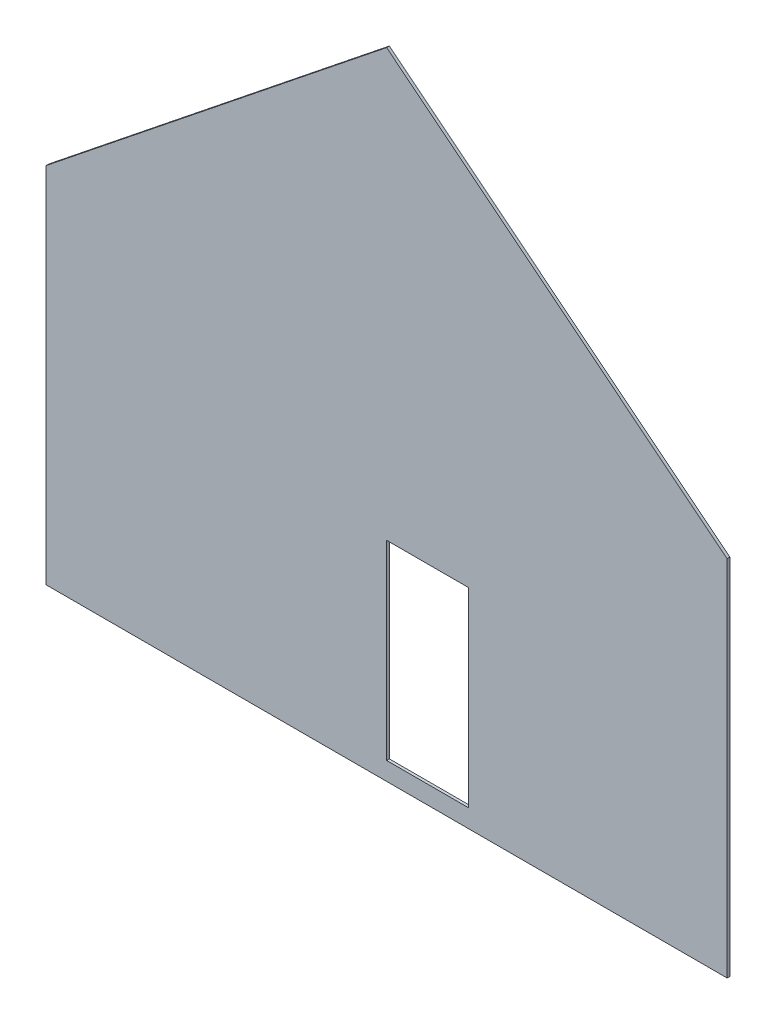
ISO-10303-21;
HEADER;
FILE_DESCRIPTION(('STEP AP214'),'2;1');
FILE_NAME('part.step','',(''),(''),'','','');
FILE_SCHEMA(('AUTOMOTIVE_DESIGN { 1 0 10303 214 1 1 1 1 }'));
ENDSEC;
DATA;
#1=APPLICATION_CONTEXT('core data for automotive mechanical design processes');
#2=APPLICATION_PROTOCOL_DEFINITION('international standard','automotive_design',2000,#1);
#3=PRODUCT_CONTEXT('',#1,'mechanical');
#4=PRODUCT('Part','Part','',(#3));
#5=PRODUCT_RELATED_PRODUCT_CATEGORY('part','',(#4));
#6=PRODUCT_DEFINITION_FORMATION('','',#4);
#7=PRODUCT_DEFINITION_CONTEXT('part definition',#1,'design');
#8=PRODUCT_DEFINITION('design','',#6,#7);
#9=PRODUCT_DEFINITION_SHAPE('','',#8);
#10=(LENGTH_UNIT() NAMED_UNIT(*) SI_UNIT(.MILLI.,.METRE.));
#11=(NAMED_UNIT(*) PLANE_ANGLE_UNIT() SI_UNIT($,.RADIAN.));
#12=(NAMED_UNIT(*) SI_UNIT($,.STERADIAN.) SOLID_ANGLE_UNIT());
#13=UNCERTAINTY_MEASURE_WITH_UNIT(LENGTH_MEASURE(1.E-05),#10,'distance_accuracy_value','');
#14=(GEOMETRIC_REPRESENTATION_CONTEXT(3) GLOBAL_UNCERTAINTY_ASSIGNED_CONTEXT((#13)) GLOBAL_UNIT_ASSIGNED_CONTEXT((#10,
#11,#12)) REPRESENTATION_CONTEXT('',''));
#15=CARTESIAN_POINT('',(0.,0.,0.));
#16=DIRECTION('',(0.,0.,1.));
#17=DIRECTION('',(1.,0.,0.));
#18=AXIS2_PLACEMENT_3D('',#15,#16,#17);
#19=CARTESIAN_POINT('',(3750.,7000.,30.));
#20=DIRECTION('',(0.624695047554424,-0.78086880944303,0.));
#21=DIRECTION('',(0.78086880944303,0.624695047554424,0.));
#22=AXIS2_PLACEMENT_3D('',#19,#20,#21);
#23=PLANE('',#22);
#24=DIRECTION('',(-0.78086880944303,-0.624695047554424,0.));
#25=VECTOR('',#24,1.);
#26=CARTESIAN_POINT('',(3750.,7000.,0.));
#27=LINE('',#26,#25);
#28=CARTESIAN_POINT('',(3750.,7000.,0.));
#29=VERTEX_POINT('',#28);
#30=CARTESIAN_POINT('',(0.,4000.,0.));
#31=VERTEX_POINT('',#30);
#32=EDGE_CURVE('E152',#29,#31,#27,.T.);
#33=ORIENTED_EDGE('',*,*,#32,.T.);
#34=DIRECTION('',(0.,0.,-1.));
#35=VECTOR('',#34,1.);
#36=CARTESIAN_POINT('',(0.,4000.,30.));
#37=LINE('',#36,#35);
#38=CARTESIAN_POINT('',(0.,4000.,30.));
#39=VERTEX_POINT('',#38);
#40=EDGE_CURVE('E204',#39,#31,#37,.T.);
#41=ORIENTED_EDGE('',*,*,#40,.F.);
#42=DIRECTION('',(-0.78086880944303,-0.624695047554424,0.));
#43=VECTOR('',#42,1.);
#44=CARTESIAN_POINT('',(3750.,7000.,30.));
#45=LINE('',#44,#43);
#46=CARTESIAN_POINT('',(3750.,7000.,30.));
#47=VERTEX_POINT('',#46);
#48=EDGE_CURVE('E157',#47,#39,#45,.T.);
#49=ORIENTED_EDGE('',*,*,#48,.F.);
#50=DIRECTION('',(0.,0.,-1.));
#51=VECTOR('',#50,1.);
#52=CARTESIAN_POINT('',(3750.,7000.,30.));
#53=LINE('',#52,#51);
#54=EDGE_CURVE('E174',#47,#29,#53,.T.);
#55=ORIENTED_EDGE('',*,*,#54,.T.);
#56=EDGE_LOOP('',(#33,#41,#49,#55));
#57=FACE_BOUND('',#56,.T.);
#58=ADVANCED_FACE('F47',(#57),#23,.F.);
#59=CARTESIAN_POINT('',(0.,0.,30.));
#60=DIRECTION('',(-1.,0.,0.));
#61=DIRECTION('',(0.,0.,1.));
#62=AXIS2_PLACEMENT_3D('',#59,#60,#61);
#63=PLANE('',#62);
#64=DIRECTION('',(0.,1.,0.));
#65=VECTOR('',#64,1.);
#66=CARTESIAN_POINT('',(0.,0.,0.));
#67=LINE('',#66,#65);
#68=CARTESIAN_POINT('',(0.,0.,0.));
#69=VERTEX_POINT('',#68);
#70=EDGE_CURVE('E178',#69,#31,#67,.T.);
#71=ORIENTED_EDGE('',*,*,#70,.F.);
#72=DIRECTION('',(0.,0.,-1.));
#73=VECTOR('',#72,1.);
#74=CARTESIAN_POINT('',(0.,0.,30.));
#75=LINE('',#74,#73);
#76=CARTESIAN_POINT('',(0.,0.,30.));
#77=VERTEX_POINT('',#76);
#78=EDGE_CURVE('E202',#77,#69,#75,.T.);
#79=ORIENTED_EDGE('',*,*,#78,.F.);
#80=DIRECTION('',(0.,1.,0.));
#81=VECTOR('',#80,1.);
#82=CARTESIAN_POINT('',(0.,0.,30.));
#83=LINE('',#82,#81);
#84=EDGE_CURVE('E159',#77,#39,#83,.T.);
#85=ORIENTED_EDGE('',*,*,#84,.T.);
#86=ORIENTED_EDGE('',*,*,#40,.T.);
#87=EDGE_LOOP('',(#71,#79,#85,#86));
#88=FACE_BOUND('',#87,.T.);
#89=ADVANCED_FACE('F231',(#88),#63,.T.);
#90=CARTESIAN_POINT('',(0.,0.,30.));
#91=DIRECTION('',(0.,1.,0.));
#92=DIRECTION('',(0.,0.,1.));
#93=AXIS2_PLACEMENT_3D('',#90,#91,#92);
#94=PLANE('',#93);
#95=DIRECTION('',(1.,0.,0.));
#96=VECTOR('',#95,1.);
#97=CARTESIAN_POINT('',(0.,0.,0.));
#98=LINE('',#97,#96);
#99=CARTESIAN_POINT('',(7500.,0.,0.));
#100=VERTEX_POINT('',#99);
#101=EDGE_CURVE('E185',#69,#100,#98,.T.);
#102=ORIENTED_EDGE('',*,*,#101,.T.);
#103=DIRECTION('',(0.,0.,-1.));
#104=VECTOR('',#103,1.);
#105=CARTESIAN_POINT('',(7500.,0.,30.));
#106=LINE('',#105,#104);
#107=CARTESIAN_POINT('',(7500.,0.,30.));
#108=VERTEX_POINT('',#107);
#109=EDGE_CURVE('E200',#108,#100,#106,.T.);
#110=ORIENTED_EDGE('',*,*,#109,.F.);
#111=DIRECTION('',(1.,0.,0.));
#112=VECTOR('',#111,1.);
#113=CARTESIAN_POINT('',(0.,0.,30.));
#114=LINE('',#113,#112);
#115=EDGE_CURVE('E164',#77,#108,#114,.T.);
#116=ORIENTED_EDGE('',*,*,#115,.F.);
#117=ORIENTED_EDGE('',*,*,#78,.T.);
#118=EDGE_LOOP('',(#102,#110,#116,#117));
#119=FACE_BOUND('',#118,.T.);
#120=ADVANCED_FACE('F237',(#119),#94,.F.);
#121=CARTESIAN_POINT('',(7500.,0.,30.));
#122=DIRECTION('',(-1.,0.,0.));
#123=DIRECTION('',(0.,0.,1.));
#124=AXIS2_PLACEMENT_3D('',#121,#122,#123);
#125=PLANE('',#124);
#126=DIRECTION('',(0.,1.,0.));
#127=VECTOR('',#126,1.);
#128=CARTESIAN_POINT('',(7500.,0.,0.));
#129=LINE('',#128,#127);
#130=CARTESIAN_POINT('',(7500.,4000.,0.));
#131=VERTEX_POINT('',#130);
#132=EDGE_CURVE('E184',#100,#131,#129,.T.);
#133=ORIENTED_EDGE('',*,*,#132,.T.);
#134=DIRECTION('',(0.,0.,-1.));
#135=VECTOR('',#134,1.);
#136=CARTESIAN_POINT('',(7500.,4000.,30.));
#137=LINE('',#136,#135);
#138=CARTESIAN_POINT('',(7500.,4000.,30.));
#139=VERTEX_POINT('',#138);
#140=EDGE_CURVE('E191',#139,#131,#137,.T.);
#141=ORIENTED_EDGE('',*,*,#140,.F.);
#142=DIRECTION('',(0.,1.,0.));
#143=VECTOR('',#142,1.);
#144=CARTESIAN_POINT('',(7500.,0.,30.));
#145=LINE('',#144,#143);
#146=EDGE_CURVE('E167',#108,#139,#145,.T.);
#147=ORIENTED_EDGE('',*,*,#146,.F.);
#148=ORIENTED_EDGE('',*,*,#109,.T.);
#149=EDGE_LOOP('',(#133,#141,#147,#148));
#150=FACE_BOUND('',#149,.T.);
#151=ADVANCED_FACE('F254',(#150),#125,.F.);
#152=CARTESIAN_POINT('',(3750.,7000.,30.));
#153=DIRECTION('',(0.624695047554424,0.78086880944303,0.));
#154=DIRECTION('',(-0.780868809443031,0.624695047554424,0.));
#155=AXIS2_PLACEMENT_3D('',#152,#153,#154);
#156=PLANE('',#155);
#157=DIRECTION('',(0.78086880944303,-0.624695047554424,0.));
#158=VECTOR('',#157,1.);
#159=CARTESIAN_POINT('',(3750.,7000.,0.));
#160=LINE('',#159,#158);
#161=EDGE_CURVE('E158',#29,#131,#160,.T.);
#162=ORIENTED_EDGE('',*,*,#161,.F.);
#163=ORIENTED_EDGE('',*,*,#54,.F.);
#164=DIRECTION('',(0.78086880944303,-0.624695047554424,0.));
#165=VECTOR('',#164,1.);
#166=CARTESIAN_POINT('',(3750.,7000.,30.));
#167=LINE('',#166,#165);
#168=EDGE_CURVE('E169',#47,#139,#167,.T.);
#169=ORIENTED_EDGE('',*,*,#168,.T.);
#170=ORIENTED_EDGE('',*,*,#140,.T.);
#171=EDGE_LOOP('',(#162,#163,#169,#170));
#172=FACE_BOUND('',#171,.T.);
#173=ADVANCED_FACE('F255',(#172),#156,.T.);
#174=CARTESIAN_POINT('',(0.,0.,30.));
#175=DIRECTION('',(0.,0.,1.));
#176=DIRECTION('',(1.,0.,0.));
#177=AXIS2_PLACEMENT_3D('',#174,#175,#176);
#178=PLANE('',#177);
#179=DIRECTION('',(1.,0.,0.));
#180=VECTOR('',#179,1.);
#181=CARTESIAN_POINT('',(3750.,200.,30.));
#182=LINE('',#181,#180);
#183=CARTESIAN_POINT('',(3750.,200.,30.));
#184=VERTEX_POINT('',#183);
#185=CARTESIAN_POINT('',(4650.,200.,30.));
#186=VERTEX_POINT('',#185);
#187=EDGE_CURVE('E64',#184,#186,#182,.T.);
#188=ORIENTED_EDGE('',*,*,#187,.F.);
#189=DIRECTION('',(0.,-1.,0.));
#190=VECTOR('',#189,1.);
#191=CARTESIAN_POINT('',(3750.,2300.,30.));
#192=LINE('',#191,#190);
#193=CARTESIAN_POINT('',(3750.,2300.,30.));
#194=VERTEX_POINT('',#193);
#195=EDGE_CURVE('E141',#194,#184,#192,.T.);
#196=ORIENTED_EDGE('',*,*,#195,.F.);
#197=DIRECTION('',(1.,0.,0.));
#198=VECTOR('',#197,1.);
#199=CARTESIAN_POINT('',(3750.,2300.,30.));
#200=LINE('',#199,#198);
#201=CARTESIAN_POINT('',(4650.,2300.,30.));
#202=VERTEX_POINT('',#201);
#203=EDGE_CURVE('E121',#194,#202,#200,.T.);
#204=ORIENTED_EDGE('',*,*,#203,.T.);
#205=DIRECTION('',(0.,-1.,0.));
#206=VECTOR('',#205,1.);
#207=CARTESIAN_POINT('',(4650.,2300.,30.));
#208=LINE('',#207,#206);
#209=EDGE_CURVE('E133',#202,#186,#208,.T.);
#210=ORIENTED_EDGE('',*,*,#209,.T.);
#211=EDGE_LOOP('',(#188,#196,#204,#210));
#212=FACE_BOUND('',#211,.T.);
#213=ORIENTED_EDGE('',*,*,#48,.T.);
#214=ORIENTED_EDGE('',*,*,#84,.F.);
#215=ORIENTED_EDGE('',*,*,#115,.T.);
#216=ORIENTED_EDGE('',*,*,#146,.T.);
#217=ORIENTED_EDGE('',*,*,#168,.F.);
#218=EDGE_LOOP('',(#213,#214,#215,#216,#217));
#219=FACE_BOUND('',#218,.T.);
#220=ADVANCED_FACE('F138',(#212,#219),#178,.T.);
#221=CARTESIAN_POINT('',(0.,0.,0.));
#222=DIRECTION('',(0.,0.,1.));
#223=DIRECTION('',(1.,0.,0.));
#224=AXIS2_PLACEMENT_3D('',#221,#222,#223);
#225=PLANE('',#224);
#226=DIRECTION('',(0.,-1.,0.));
#227=VECTOR('',#226,1.);
#228=CARTESIAN_POINT('',(3750.,0.,0.));
#229=LINE('',#228,#227);
#230=CARTESIAN_POINT('',(3750.,2300.,0.));
#231=VERTEX_POINT('',#230);
#232=CARTESIAN_POINT('',(3750.,200.,0.));
#233=VERTEX_POINT('',#232);
#234=EDGE_CURVE('E60',#231,#233,#229,.T.);
#235=ORIENTED_EDGE('',*,*,#234,.T.);
#236=DIRECTION('',(1.,0.,0.));
#237=VECTOR('',#236,1.);
#238=CARTESIAN_POINT('',(0.,199.999999999999,0.));
#239=LINE('',#238,#237);
#240=CARTESIAN_POINT('',(4650.,200.,0.));
#241=VERTEX_POINT('',#240);
#242=EDGE_CURVE('E11',#233,#241,#239,.T.);
#243=ORIENTED_EDGE('',*,*,#242,.T.);
#244=DIRECTION('',(0.,-1.,0.));
#245=VECTOR('',#244,1.);
#246=CARTESIAN_POINT('',(4650.,0.,0.));
#247=LINE('',#246,#245);
#248=CARTESIAN_POINT('',(4650.,2300.,0.));
#249=VERTEX_POINT('',#248);
#250=EDGE_CURVE('E210',#249,#241,#247,.T.);
#251=ORIENTED_EDGE('',*,*,#250,.F.);
#252=DIRECTION('',(1.,0.,0.));
#253=VECTOR('',#252,1.);
#254=CARTESIAN_POINT('',(1.13489464739461E-12,2300.,0.));
#255=LINE('',#254,#253);
#256=EDGE_CURVE('E128',#231,#249,#255,.T.);
#257=ORIENTED_EDGE('',*,*,#256,.F.);
#258=EDGE_LOOP('',(#235,#243,#251,#257));
#259=FACE_BOUND('',#258,.T.);
#260=ORIENTED_EDGE('',*,*,#32,.F.);
#261=ORIENTED_EDGE('',*,*,#161,.T.);
#262=ORIENTED_EDGE('',*,*,#132,.F.);
#263=ORIENTED_EDGE('',*,*,#101,.F.);
#264=ORIENTED_EDGE('',*,*,#70,.T.);
#265=EDGE_LOOP('',(#260,#261,#262,#263,#264));
#266=FACE_BOUND('',#265,.T.);
#267=ADVANCED_FACE('F215',(#259,#266),#225,.F.);
#268=CARTESIAN_POINT('',(3750.,200.,-1323.));
#269=DIRECTION('',(0.,-1.,0.));
#270=DIRECTION('',(1.,0.,0.));
#271=AXIS2_PLACEMENT_3D('',#268,#269,#270);
#272=PLANE('',#271);
#273=DIRECTION('',(0.,0.,1.));
#274=VECTOR('',#273,1.);
#275=CARTESIAN_POINT('',(3750.,200.,-1323.));
#276=LINE('',#275,#274);
#277=EDGE_CURVE('E149',#233,#184,#276,.T.);
#278=ORIENTED_EDGE('',*,*,#277,.T.);
#279=ORIENTED_EDGE('',*,*,#187,.T.);
#280=DIRECTION('',(0.,0.,1.));
#281=VECTOR('',#280,1.);
#282=CARTESIAN_POINT('',(4650.,200.,-1323.));
#283=LINE('',#282,#281);
#284=EDGE_CURVE('E127',#241,#186,#283,.T.);
#285=ORIENTED_EDGE('',*,*,#284,.F.);
#286=ORIENTED_EDGE('',*,*,#242,.F.);
#287=EDGE_LOOP('',(#278,#279,#285,#286));
#288=FACE_BOUND('',#287,.T.);
#289=ADVANCED_FACE('F219',(#288),#272,.F.);
#290=CARTESIAN_POINT('',(3750.,2300.,-1323.));
#291=DIRECTION('',(-1.,0.,0.));
#292=DIRECTION('',(0.,0.,1.));
#293=AXIS2_PLACEMENT_3D('',#290,#291,#292);
#294=PLANE('',#293);
#295=DIRECTION('',(0.,0.,1.));
#296=VECTOR('',#295,1.);
#297=CARTESIAN_POINT('',(3750.,2300.,-1323.));
#298=LINE('',#297,#296);
#299=EDGE_CURVE('E129',#231,#194,#298,.T.);
#300=ORIENTED_EDGE('',*,*,#299,.T.);
#301=ORIENTED_EDGE('',*,*,#195,.T.);
#302=ORIENTED_EDGE('',*,*,#277,.F.);
#303=ORIENTED_EDGE('',*,*,#234,.F.);
#304=EDGE_LOOP('',(#300,#301,#302,#303));
#305=FACE_BOUND('',#304,.T.);
#306=ADVANCED_FACE('F216',(#305),#294,.F.);
#307=CARTESIAN_POINT('',(3750.,2300.,-1323.));
#308=DIRECTION('',(0.,-1.,0.));
#309=DIRECTION('',(1.,0.,0.));
#310=AXIS2_PLACEMENT_3D('',#307,#308,#309);
#311=PLANE('',#310);
#312=ORIENTED_EDGE('',*,*,#256,.T.);
#313=DIRECTION('',(0.,0.,1.));
#314=VECTOR('',#313,1.);
#315=CARTESIAN_POINT('',(4650.,2300.,-1323.));
#316=LINE('',#315,#314);
#317=EDGE_CURVE('E75',#249,#202,#316,.T.);
#318=ORIENTED_EDGE('',*,*,#317,.T.);
#319=ORIENTED_EDGE('',*,*,#203,.F.);
#320=ORIENTED_EDGE('',*,*,#299,.F.);
#321=EDGE_LOOP('',(#312,#318,#319,#320));
#322=FACE_BOUND('',#321,.T.);
#323=ADVANCED_FACE('F116',(#322),#311,.T.);
#324=CARTESIAN_POINT('',(4650.,2300.,-1323.));
#325=DIRECTION('',(-1.,0.,0.));
#326=DIRECTION('',(0.,0.,1.));
#327=AXIS2_PLACEMENT_3D('',#324,#325,#326);
#328=PLANE('',#327);
#329=ORIENTED_EDGE('',*,*,#250,.T.);
#330=ORIENTED_EDGE('',*,*,#284,.T.);
#331=ORIENTED_EDGE('',*,*,#209,.F.);
#332=ORIENTED_EDGE('',*,*,#317,.F.);
#333=EDGE_LOOP('',(#329,#330,#331,#332));
#334=FACE_BOUND('',#333,.T.);
#335=ADVANCED_FACE('F132',(#334),#328,.T.);
#336=CLOSED_SHELL('',(#58,#89,#120,#151,#173,#220,#267,#289,#306,#323,#335));
#337=MANIFOLD_SOLID_BREP('B2',#336);
#338=ADVANCED_BREP_SHAPE_REPRESENTATION('',(#18,#337),#14);
#339=SHAPE_DEFINITION_REPRESENTATION(#9,#338);
ENDSEC;
END-ISO-10303-21;
